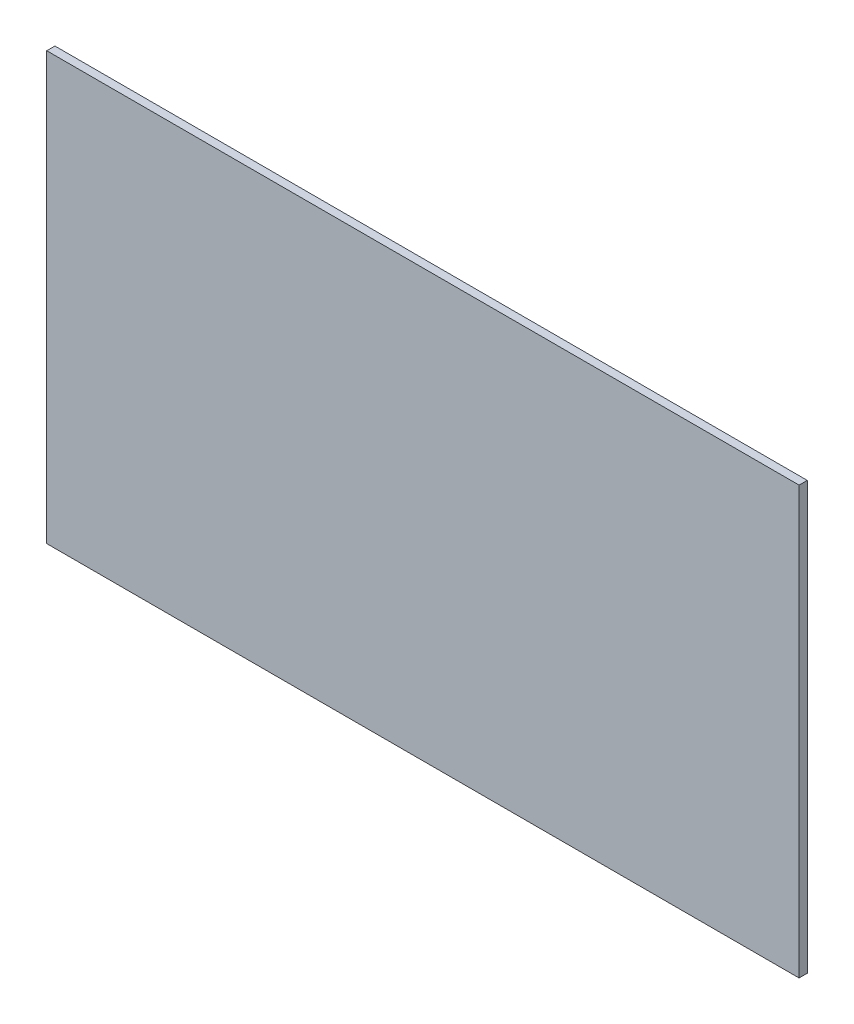
ISO-10303-21;
HEADER;
FILE_DESCRIPTION(('STEP AP214'),'2;1');
FILE_NAME('part.step','',(''),(''),'','','');
FILE_SCHEMA(('AUTOMOTIVE_DESIGN { 1 0 10303 214 1 1 1 1 }'));
ENDSEC;
DATA;
#1=APPLICATION_CONTEXT('core data for automotive mechanical design processes');
#2=APPLICATION_PROTOCOL_DEFINITION('international standard','automotive_design',2000,#1);
#3=PRODUCT_CONTEXT('',#1,'mechanical');
#4=PRODUCT('Part','Part','',(#3));
#5=PRODUCT_RELATED_PRODUCT_CATEGORY('part','',(#4));
#6=PRODUCT_DEFINITION_FORMATION('','',#4);
#7=PRODUCT_DEFINITION_CONTEXT('part definition',#1,'design');
#8=PRODUCT_DEFINITION('design','',#6,#7);
#9=PRODUCT_DEFINITION_SHAPE('','',#8);
#10=(LENGTH_UNIT() NAMED_UNIT(*) SI_UNIT(.MILLI.,.METRE.));
#11=(NAMED_UNIT(*) PLANE_ANGLE_UNIT() SI_UNIT($,.RADIAN.));
#12=(NAMED_UNIT(*) SI_UNIT($,.STERADIAN.) SOLID_ANGLE_UNIT());
#13=UNCERTAINTY_MEASURE_WITH_UNIT(LENGTH_MEASURE(1.E-05),#10,'distance_accuracy_value','');
#14=(GEOMETRIC_REPRESENTATION_CONTEXT(3) GLOBAL_UNCERTAINTY_ASSIGNED_CONTEXT((#13)) GLOBAL_UNIT_ASSIGNED_CONTEXT((#10,
#11,#12)) REPRESENTATION_CONTEXT('',''));
#15=CARTESIAN_POINT('',(0.,0.,0.));
#16=DIRECTION('',(0.,0.,1.));
#17=DIRECTION('',(1.,0.,0.));
#18=AXIS2_PLACEMENT_3D('',#15,#16,#17);
#19=CARTESIAN_POINT('',(230.,130.5,5.));
#20=DIRECTION('',(-1.,0.,0.));
#21=DIRECTION('',(0.,-1.,0.));
#22=AXIS2_PLACEMENT_3D('',#19,#20,#21);
#23=PLANE('',#22);
#24=DIRECTION('',(0.,1.,0.));
#25=VECTOR('',#24,1.);
#26=CARTESIAN_POINT('',(230.,130.5,0.));
#27=LINE('',#26,#25);
#28=CARTESIAN_POINT('',(230.,-130.5,0.));
#29=VERTEX_POINT('',#28);
#30=CARTESIAN_POINT('',(230.,130.5,0.));
#31=VERTEX_POINT('',#30);
#32=EDGE_CURVE('E107',#29,#31,#27,.T.);
#33=ORIENTED_EDGE('',*,*,#32,.T.);
#34=DIRECTION('',(0.,0.,-1.));
#35=VECTOR('',#34,1.);
#36=CARTESIAN_POINT('',(230.,130.5,5.));
#37=LINE('',#36,#35);
#38=CARTESIAN_POINT('',(230.,130.5,5.));
#39=VERTEX_POINT('',#38);
#40=EDGE_CURVE('E11',#39,#31,#37,.T.);
#41=ORIENTED_EDGE('',*,*,#40,.F.);
#42=DIRECTION('',(0.,1.,0.));
#43=VECTOR('',#42,1.);
#44=CARTESIAN_POINT('',(230.,130.5,5.));
#45=LINE('',#44,#43);
#46=CARTESIAN_POINT('',(230.,-130.5,5.));
#47=VERTEX_POINT('',#46);
#48=EDGE_CURVE('E91',#47,#39,#45,.T.);
#49=ORIENTED_EDGE('',*,*,#48,.F.);
#50=DIRECTION('',(0.,0.,-1.));
#51=VECTOR('',#50,1.);
#52=CARTESIAN_POINT('',(230.,-130.5,5.));
#53=LINE('',#52,#51);
#54=EDGE_CURVE('E103',#47,#29,#53,.T.);
#55=ORIENTED_EDGE('',*,*,#54,.T.);
#56=EDGE_LOOP('',(#33,#41,#49,#55));
#57=FACE_BOUND('',#56,.T.);
#58=ADVANCED_FACE('F39',(#57),#23,.F.);
#59=CARTESIAN_POINT('',(-230.,130.5,5.));
#60=DIRECTION('',(0.,-1.,0.));
#61=DIRECTION('',(0.,0.,-1.));
#62=AXIS2_PLACEMENT_3D('',#59,#60,#61);
#63=PLANE('',#62);
#64=DIRECTION('',(-1.,0.,0.));
#65=VECTOR('',#64,1.);
#66=CARTESIAN_POINT('',(-230.,130.5,0.));
#67=LINE('',#66,#65);
#68=CARTESIAN_POINT('',(-230.,130.5,0.));
#69=VERTEX_POINT('',#68);
#70=EDGE_CURVE('E96',#31,#69,#67,.T.);
#71=ORIENTED_EDGE('',*,*,#70,.T.);
#72=DIRECTION('',(0.,0.,-1.));
#73=VECTOR('',#72,1.);
#74=CARTESIAN_POINT('',(-230.,130.5,5.));
#75=LINE('',#74,#73);
#76=CARTESIAN_POINT('',(-230.,130.5,5.));
#77=VERTEX_POINT('',#76);
#78=EDGE_CURVE('E48',#77,#69,#75,.T.);
#79=ORIENTED_EDGE('',*,*,#78,.F.);
#80=DIRECTION('',(-1.,0.,0.));
#81=VECTOR('',#80,1.);
#82=CARTESIAN_POINT('',(-230.,130.5,5.));
#83=LINE('',#82,#81);
#84=EDGE_CURVE('E86',#39,#77,#83,.T.);
#85=ORIENTED_EDGE('',*,*,#84,.F.);
#86=ORIENTED_EDGE('',*,*,#40,.T.);
#87=EDGE_LOOP('',(#71,#79,#85,#86));
#88=FACE_BOUND('',#87,.T.);
#89=ADVANCED_FACE('F95',(#88),#63,.F.);
#90=CARTESIAN_POINT('',(-230.,130.5,5.));
#91=DIRECTION('',(1.,0.,0.));
#92=DIRECTION('',(0.,1.,0.));
#93=AXIS2_PLACEMENT_3D('',#90,#91,#92);
#94=PLANE('',#93);
#95=DIRECTION('',(0.,-1.,0.));
#96=VECTOR('',#95,1.);
#97=CARTESIAN_POINT('',(-230.,130.5,0.));
#98=LINE('',#97,#96);
#99=CARTESIAN_POINT('',(-230.,-130.5,0.));
#100=VERTEX_POINT('',#99);
#101=EDGE_CURVE('E73',#69,#100,#98,.T.);
#102=ORIENTED_EDGE('',*,*,#101,.T.);
#103=DIRECTION('',(0.,0.,-1.));
#104=VECTOR('',#103,1.);
#105=CARTESIAN_POINT('',(-230.,-130.5,5.));
#106=LINE('',#105,#104);
#107=CARTESIAN_POINT('',(-230.,-130.5,5.));
#108=VERTEX_POINT('',#107);
#109=EDGE_CURVE('E98',#108,#100,#106,.T.);
#110=ORIENTED_EDGE('',*,*,#109,.F.);
#111=DIRECTION('',(0.,-1.,0.));
#112=VECTOR('',#111,1.);
#113=CARTESIAN_POINT('',(-230.,130.5,5.));
#114=LINE('',#113,#112);
#115=EDGE_CURVE('E89',#77,#108,#114,.T.);
#116=ORIENTED_EDGE('',*,*,#115,.F.);
#117=ORIENTED_EDGE('',*,*,#78,.T.);
#118=EDGE_LOOP('',(#102,#110,#116,#117));
#119=FACE_BOUND('',#118,.T.);
#120=ADVANCED_FACE('F99',(#119),#94,.F.);
#121=CARTESIAN_POINT('',(-230.,-130.5,5.));
#122=DIRECTION('',(0.,1.,0.));
#123=DIRECTION('',(0.,0.,1.));
#124=AXIS2_PLACEMENT_3D('',#121,#122,#123);
#125=PLANE('',#124);
#126=DIRECTION('',(1.,0.,0.));
#127=VECTOR('',#126,1.);
#128=CARTESIAN_POINT('',(-230.,-130.5,0.));
#129=LINE('',#128,#127);
#130=EDGE_CURVE('E79',#100,#29,#129,.T.);
#131=ORIENTED_EDGE('',*,*,#130,.T.);
#132=ORIENTED_EDGE('',*,*,#54,.F.);
#133=DIRECTION('',(1.,0.,0.));
#134=VECTOR('',#133,1.);
#135=CARTESIAN_POINT('',(-230.,-130.5,5.));
#136=LINE('',#135,#134);
#137=EDGE_CURVE('E56',#108,#47,#136,.T.);
#138=ORIENTED_EDGE('',*,*,#137,.F.);
#139=ORIENTED_EDGE('',*,*,#109,.T.);
#140=EDGE_LOOP('',(#131,#132,#138,#139));
#141=FACE_BOUND('',#140,.T.);
#142=ADVANCED_FACE('F120',(#141),#125,.F.);
#143=CARTESIAN_POINT('',(0.,0.,5.));
#144=DIRECTION('',(0.,0.,1.));
#145=DIRECTION('',(1.,0.,0.));
#146=AXIS2_PLACEMENT_3D('',#143,#144,#145);
#147=PLANE('',#146);
#148=ORIENTED_EDGE('',*,*,#48,.T.);
#149=ORIENTED_EDGE('',*,*,#84,.T.);
#150=ORIENTED_EDGE('',*,*,#115,.T.);
#151=ORIENTED_EDGE('',*,*,#137,.T.);
#152=EDGE_LOOP('',(#148,#149,#150,#151));
#153=FACE_BOUND('',#152,.T.);
#154=ADVANCED_FACE('F87',(#153),#147,.T.);
#155=CARTESIAN_POINT('',(0.,0.,0.));
#156=DIRECTION('',(0.,0.,1.));
#157=DIRECTION('',(1.,0.,0.));
#158=AXIS2_PLACEMENT_3D('',#155,#156,#157);
#159=PLANE('',#158);
#160=ORIENTED_EDGE('',*,*,#32,.F.);
#161=ORIENTED_EDGE('',*,*,#130,.F.);
#162=ORIENTED_EDGE('',*,*,#101,.F.);
#163=ORIENTED_EDGE('',*,*,#70,.F.);
#164=EDGE_LOOP('',(#160,#161,#162,#163));
#165=FACE_BOUND('',#164,.T.);
#166=ADVANCED_FACE('F123',(#165),#159,.F.);
#167=CLOSED_SHELL('',(#58,#89,#120,#142,#154,#166));
#168=MANIFOLD_SOLID_BREP('B2',#167);
#169=ADVANCED_BREP_SHAPE_REPRESENTATION('',(#18,#168),#14);
#170=SHAPE_DEFINITION_REPRESENTATION(#9,#169);
ENDSEC;
END-ISO-10303-21;
